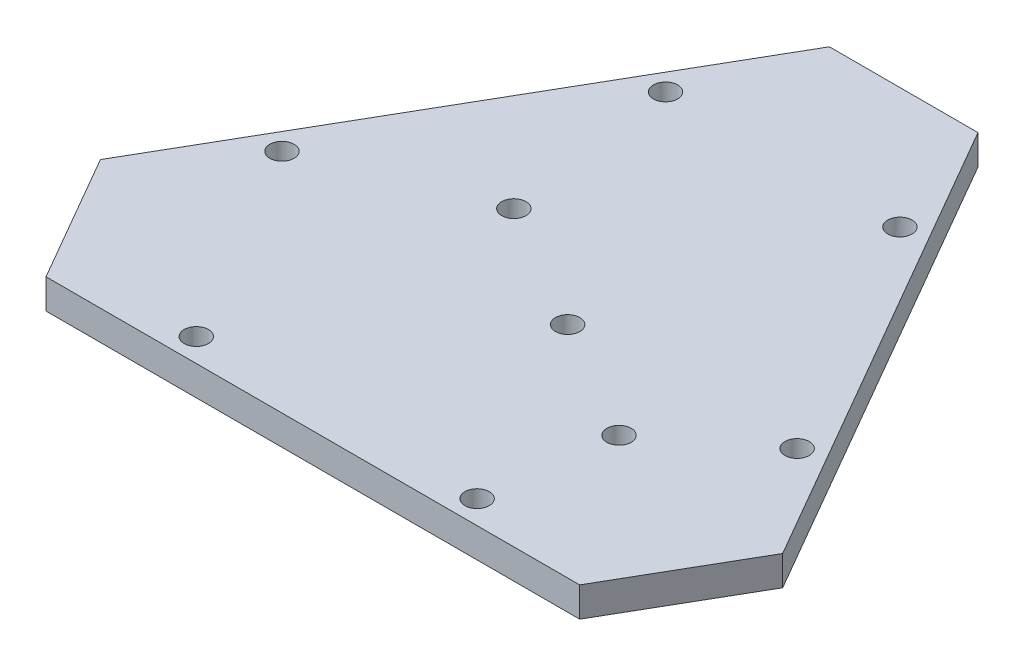
ISO-10303-21;
HEADER;
FILE_DESCRIPTION(('STEP AP214'),'2;1');
FILE_NAME('part.step','',(''),(''),'','','');
FILE_SCHEMA(('AUTOMOTIVE_DESIGN { 1 0 10303 214 1 1 1 1 }'));
ENDSEC;
DATA;
#1=APPLICATION_CONTEXT('core data for automotive mechanical design processes');
#2=APPLICATION_PROTOCOL_DEFINITION('international standard','automotive_design',2000,#1);
#3=PRODUCT_CONTEXT('',#1,'mechanical');
#4=PRODUCT('Part','Part','',(#3));
#5=PRODUCT_RELATED_PRODUCT_CATEGORY('part','',(#4));
#6=PRODUCT_DEFINITION_FORMATION('','',#4);
#7=PRODUCT_DEFINITION_CONTEXT('part definition',#1,'design');
#8=PRODUCT_DEFINITION('design','',#6,#7);
#9=PRODUCT_DEFINITION_SHAPE('','',#8);
#10=(LENGTH_UNIT() NAMED_UNIT(*) SI_UNIT(.MILLI.,.METRE.));
#11=(NAMED_UNIT(*) PLANE_ANGLE_UNIT() SI_UNIT($,.RADIAN.));
#12=(NAMED_UNIT(*) SI_UNIT($,.STERADIAN.) SOLID_ANGLE_UNIT());
#13=UNCERTAINTY_MEASURE_WITH_UNIT(LENGTH_MEASURE(1.E-05),#10,'distance_accuracy_value','');
#14=(GEOMETRIC_REPRESENTATION_CONTEXT(3) GLOBAL_UNCERTAINTY_ASSIGNED_CONTEXT((#13)) GLOBAL_UNIT_ASSIGNED_CONTEXT((#10,
#11,#12)) REPRESENTATION_CONTEXT('',''));
#15=CARTESIAN_POINT('',(0.,0.,0.));
#16=DIRECTION('',(0.,0.,1.));
#17=DIRECTION('',(1.,0.,0.));
#18=AXIS2_PLACEMENT_3D('',#15,#16,#17);
#19=CARTESIAN_POINT('',(-57.014405283833,6.35,51.2481532850778));
#20=DIRECTION('',(0.,0.,-1.));
#21=DIRECTION('',(-1.,0.,0.));
#22=AXIS2_PLACEMENT_3D('',#19,#20,#21);
#23=PLANE('',#22);
#24=DIRECTION('',(1.,0.,0.));
#25=VECTOR('',#24,1.);
#26=CARTESIAN_POINT('',(-57.014405283833,0.,51.2481532850778));
#27=LINE('',#26,#25);
#28=CARTESIAN_POINT('',(-57.014405283833,0.,51.2481532850778));
#29=VERTEX_POINT('',#28);
#30=CARTESIAN_POINT('',(57.0144052838327,0.,51.2481532850782));
#31=VERTEX_POINT('',#30);
#32=EDGE_CURVE('E133',#29,#31,#27,.T.);
#33=ORIENTED_EDGE('',*,*,#32,.T.);
#34=DIRECTION('',(0.,-1.,0.));
#35=VECTOR('',#34,1.);
#36=CARTESIAN_POINT('',(57.0144052838327,6.35,51.2481532850782));
#37=LINE('',#36,#35);
#38=CARTESIAN_POINT('',(57.0144052838327,6.35,51.2481532850782));
#39=VERTEX_POINT('',#38);
#40=EDGE_CURVE('E11',#39,#31,#37,.T.);
#41=ORIENTED_EDGE('',*,*,#40,.F.);
#42=DIRECTION('',(1.,0.,0.));
#43=VECTOR('',#42,1.);
#44=CARTESIAN_POINT('',(-57.014405283833,6.35,51.2481532850778));
#45=LINE('',#44,#43);
#46=CARTESIAN_POINT('',(-57.014405283833,6.35,51.2481532850778));
#47=VERTEX_POINT('',#46);
#48=EDGE_CURVE('E150',#47,#39,#45,.T.);
#49=ORIENTED_EDGE('',*,*,#48,.F.);
#50=DIRECTION('',(0.,-1.,0.));
#51=VECTOR('',#50,1.);
#52=CARTESIAN_POINT('',(-57.014405283833,6.35,51.2481532850778));
#53=LINE('',#52,#51);
#54=EDGE_CURVE('E129',#47,#29,#53,.T.);
#55=ORIENTED_EDGE('',*,*,#54,.T.);
#56=EDGE_LOOP('',(#33,#41,#49,#55));
#57=FACE_BOUND('',#56,.T.);
#58=ADVANCED_FACE('F44',(#57),#23,.F.);
#59=CARTESIAN_POINT('',(57.0144052838327,6.35,51.2481532850782));
#60=DIRECTION('',(-0.866025403784436,0.,-0.500000000000004));
#61=DIRECTION('',(-0.500000000000004,0.,0.866025403784436));
#62=AXIS2_PLACEMENT_3D('',#59,#60,#61);
#63=PLANE('',#62);
#64=DIRECTION('',(0.500000000000004,0.,-0.866025403784436));
#65=VECTOR('',#64,1.);
#66=CARTESIAN_POINT('',(57.0144052838327,0.,51.2481532850782));
#67=LINE('',#66,#65);
#68=CARTESIAN_POINT('',(72.8894052838328,0.,23.7518467149224));
#69=VERTEX_POINT('',#68);
#70=EDGE_CURVE('E137',#31,#69,#67,.T.);
#71=ORIENTED_EDGE('',*,*,#70,.T.);
#72=DIRECTION('',(0.,-1.,0.));
#73=VECTOR('',#72,1.);
#74=CARTESIAN_POINT('',(72.8894052838328,6.35,23.7518467149224));
#75=LINE('',#74,#73);
#76=CARTESIAN_POINT('',(72.8894052838328,6.35,23.7518467149224));
#77=VERTEX_POINT('',#76);
#78=EDGE_CURVE('E53',#77,#69,#75,.T.);
#79=ORIENTED_EDGE('',*,*,#78,.F.);
#80=DIRECTION('',(0.500000000000004,0.,-0.866025403784436));
#81=VECTOR('',#80,1.);
#82=CARTESIAN_POINT('',(57.0144052838327,6.35,51.2481532850782));
#83=LINE('',#82,#81);
#84=EDGE_CURVE('E98',#39,#77,#83,.T.);
#85=ORIENTED_EDGE('',*,*,#84,.F.);
#86=ORIENTED_EDGE('',*,*,#40,.T.);
#87=EDGE_LOOP('',(#71,#79,#85,#86));
#88=FACE_BOUND('',#87,.T.);
#89=ADVANCED_FACE('F179',(#88),#63,.F.);
#90=CARTESIAN_POINT('',(72.8894052838328,6.35,23.7518467149224));
#91=DIRECTION('',(-0.86602540378444,0.,0.499999999999998));
#92=DIRECTION('',(0.499999999999998,0.,0.86602540378444));
#93=AXIS2_PLACEMENT_3D('',#90,#91,#92);
#94=PLANE('',#93);
#95=DIRECTION('',(-0.499999999999998,0.,-0.86602540378444));
#96=VECTOR('',#95,1.);
#97=CARTESIAN_POINT('',(72.8894052838328,0.,23.7518467149224));
#98=LINE('',#97,#96);
#99=CARTESIAN_POINT('',(15.875,0.,-75.));
#100=VERTEX_POINT('',#99);
#101=EDGE_CURVE('E141',#69,#100,#98,.T.);
#102=ORIENTED_EDGE('',*,*,#101,.T.);
#103=DIRECTION('',(0.,-1.,0.));
#104=VECTOR('',#103,1.);
#105=CARTESIAN_POINT('',(15.875,6.35,-75.));
#106=LINE('',#105,#104);
#107=CARTESIAN_POINT('',(15.875,6.35,-75.));
#108=VERTEX_POINT('',#107);
#109=EDGE_CURVE('E122',#108,#100,#106,.T.);
#110=ORIENTED_EDGE('',*,*,#109,.F.);
#111=DIRECTION('',(-0.499999999999998,0.,-0.86602540378444));
#112=VECTOR('',#111,1.);
#113=CARTESIAN_POINT('',(72.8894052838328,6.35,23.7518467149224));
#114=LINE('',#113,#112);
#115=EDGE_CURVE('E111',#77,#108,#114,.T.);
#116=ORIENTED_EDGE('',*,*,#115,.F.);
#117=ORIENTED_EDGE('',*,*,#78,.T.);
#118=EDGE_LOOP('',(#102,#110,#116,#117));
#119=FACE_BOUND('',#118,.T.);
#120=ADVANCED_FACE('F160',(#119),#94,.F.);
#121=CARTESIAN_POINT('',(-15.875,6.35,-75.));
#122=DIRECTION('',(0.,0.,1.));
#123=DIRECTION('',(1.,0.,0.));
#124=AXIS2_PLACEMENT_3D('',#121,#122,#123);
#125=PLANE('',#124);
#126=DIRECTION('',(-1.,0.,0.));
#127=VECTOR('',#126,1.);
#128=CARTESIAN_POINT('',(-15.875,0.,-75.));
#129=LINE('',#128,#127);
#130=CARTESIAN_POINT('',(-15.875,0.,-75.));
#131=VERTEX_POINT('',#130);
#132=EDGE_CURVE('E120',#100,#131,#129,.T.);
#133=ORIENTED_EDGE('',*,*,#132,.T.);
#134=DIRECTION('',(0.,-1.,0.));
#135=VECTOR('',#134,1.);
#136=CARTESIAN_POINT('',(-15.875,6.35,-75.));
#137=LINE('',#136,#135);
#138=CARTESIAN_POINT('',(-15.875,6.35,-75.));
#139=VERTEX_POINT('',#138);
#140=EDGE_CURVE('E117',#139,#131,#137,.T.);
#141=ORIENTED_EDGE('',*,*,#140,.F.);
#142=DIRECTION('',(-1.,0.,0.));
#143=VECTOR('',#142,1.);
#144=CARTESIAN_POINT('',(-15.875,6.35,-75.));
#145=LINE('',#144,#143);
#146=EDGE_CURVE('E105',#108,#139,#145,.T.);
#147=ORIENTED_EDGE('',*,*,#146,.F.);
#148=ORIENTED_EDGE('',*,*,#109,.T.);
#149=EDGE_LOOP('',(#133,#141,#147,#148));
#150=FACE_BOUND('',#149,.T.);
#151=ADVANCED_FACE('F118',(#150),#125,.F.);
#152=CARTESIAN_POINT('',(-15.875,6.35,-75.));
#153=DIRECTION('',(0.866025403784438,0.,0.500000000000001));
#154=DIRECTION('',(0.500000000000001,0.,-0.866025403784438));
#155=AXIS2_PLACEMENT_3D('',#152,#153,#154);
#156=PLANE('',#155);
#157=DIRECTION('',(-0.500000000000001,0.,0.866025403784438));
#158=VECTOR('',#157,1.);
#159=CARTESIAN_POINT('',(-15.875,0.,-75.));
#160=LINE('',#159,#158);
#161=CARTESIAN_POINT('',(-72.8894052838329,0.,23.7518467149219));
#162=VERTEX_POINT('',#161);
#163=EDGE_CURVE('E84',#131,#162,#160,.T.);
#164=ORIENTED_EDGE('',*,*,#163,.T.);
#165=DIRECTION('',(0.,-1.,0.));
#166=VECTOR('',#165,1.);
#167=CARTESIAN_POINT('',(-72.8894052838329,6.35,23.7518467149219));
#168=LINE('',#167,#166);
#169=CARTESIAN_POINT('',(-72.8894052838329,6.35,23.7518467149219));
#170=VERTEX_POINT('',#169);
#171=EDGE_CURVE('E123',#170,#162,#168,.T.);
#172=ORIENTED_EDGE('',*,*,#171,.F.);
#173=DIRECTION('',(-0.500000000000001,0.,0.866025403784438));
#174=VECTOR('',#173,1.);
#175=CARTESIAN_POINT('',(-15.875,6.35,-75.));
#176=LINE('',#175,#174);
#177=EDGE_CURVE('E109',#139,#170,#176,.T.);
#178=ORIENTED_EDGE('',*,*,#177,.F.);
#179=ORIENTED_EDGE('',*,*,#140,.T.);
#180=EDGE_LOOP('',(#164,#172,#178,#179));
#181=FACE_BOUND('',#180,.T.);
#182=ADVANCED_FACE('F125',(#181),#156,.F.);
#183=CARTESIAN_POINT('',(-57.014405283833,6.35,51.2481532850778));
#184=DIRECTION('',(0.86602540378444,0.,-0.499999999999998));
#185=DIRECTION('',(-0.499999999999998,0.,-0.86602540378444));
#186=AXIS2_PLACEMENT_3D('',#183,#184,#185);
#187=PLANE('',#186);
#188=DIRECTION('',(0.499999999999998,0.,0.86602540378444));
#189=VECTOR('',#188,1.);
#190=CARTESIAN_POINT('',(-57.014405283833,0.,51.2481532850778));
#191=LINE('',#190,#189);
#192=EDGE_CURVE('E90',#162,#29,#191,.T.);
#193=ORIENTED_EDGE('',*,*,#192,.T.);
#194=ORIENTED_EDGE('',*,*,#54,.F.);
#195=DIRECTION('',(0.499999999999998,0.,0.86602540378444));
#196=VECTOR('',#195,1.);
#197=CARTESIAN_POINT('',(-57.014405283833,6.35,51.2481532850778));
#198=LINE('',#197,#196);
#199=EDGE_CURVE('E61',#170,#47,#198,.T.);
#200=ORIENTED_EDGE('',*,*,#199,.F.);
#201=ORIENTED_EDGE('',*,*,#171,.T.);
#202=EDGE_LOOP('',(#193,#194,#200,#201));
#203=FACE_BOUND('',#202,.T.);
#204=ADVANCED_FACE('F167',(#203),#187,.F.);
#205=CARTESIAN_POINT('',(0.,6.35,0.));
#206=DIRECTION('',(0.,1.,0.));
#207=DIRECTION('',(0.,0.,1.));
#208=AXIS2_PLACEMENT_3D('',#205,#206,#207);
#209=PLANE('',#208);
#210=CARTESIAN_POINT('',(33.5392518830543,6.35,19.3638961031003));
#211=DIRECTION('',(0.,1.,0.));
#212=DIRECTION('',(0.,0.,1.));
#213=AXIS2_PLACEMENT_3D('',#210,#211,#212);
#214=CIRCLE('',#213,2.6);
#215=CARTESIAN_POINT('',(33.5392518830543,6.35,21.9638961031003));
#216=VERTEX_POINT('',#215);
#217=EDGE_CURVE('E363',#216,#216,#214,.T.);
#218=ORIENTED_EDGE('',*,*,#217,.F.);
#219=EDGE_LOOP('',(#218));
#220=FACE_BOUND('',#219,.T.);
#221=CARTESIAN_POINT('',(7.55848976952117,6.35,4.36389610310027));
#222=DIRECTION('',(0.,1.,0.));
#223=DIRECTION('',(0.,0.,1.));
#224=AXIS2_PLACEMENT_3D('',#221,#222,#223);
#225=CIRCLE('',#224,2.6);
#226=CARTESIAN_POINT('',(7.55848976952117,6.35,6.96389610310027));
#227=VERTEX_POINT('',#226);
#228=EDGE_CURVE('E365',#227,#227,#225,.T.);
#229=ORIENTED_EDGE('',*,*,#228,.F.);
#230=EDGE_LOOP('',(#229));
#231=FACE_BOUND('',#230,.T.);
#232=CARTESIAN_POINT('',(-19.638606793364,6.35,-11.3383549186578));
#233=DIRECTION('',(0.,1.,0.));
#234=DIRECTION('',(0.,0.,1.));
#235=AXIS2_PLACEMENT_3D('',#232,#233,#234);
#236=CIRCLE('',#235,2.6);
#237=CARTESIAN_POINT('',(-19.638606793364,6.35,-8.73835491865783));
#238=VERTEX_POINT('',#237);
#239=EDGE_CURVE('E378',#238,#238,#236,.T.);
#240=ORIENTED_EDGE('',*,*,#239,.F.);
#241=EDGE_LOOP('',(#240));
#242=FACE_BOUND('',#241,.T.);
#243=CARTESIAN_POINT('',(-55.0301887449073,6.35,2.81877628612842));
#244=DIRECTION('',(0.,1.,0.));
#245=DIRECTION('',(0.,0.,1.));
#246=AXIS2_PLACEMENT_3D('',#243,#244,#245);
#247=CIRCLE('',#246,2.6);
#248=CARTESIAN_POINT('',(-55.0301887449073,6.35,5.41877628612841));
#249=VERTEX_POINT('',#248);
#250=EDGE_CURVE('E403',#249,#249,#247,.T.);
#251=ORIENTED_EDGE('',*,*,#250,.F.);
#252=EDGE_LOOP('',(#251));
#253=FACE_BOUND('',#252,.T.);
#254=CARTESIAN_POINT('',(30.0988433702189,6.35,46.2481532850775));
#255=DIRECTION('',(0.,1.,0.));
#256=DIRECTION('',(0.,0.,1.));
#257=AXIS2_PLACEMENT_3D('',#254,#255,#256);
#258=CIRCLE('',#257,2.6);
#259=CARTESIAN_POINT('',(30.0988433702189,6.35,48.8481532850775));
#260=VERTEX_POINT('',#259);
#261=EDGE_CURVE('E394',#260,#260,#258,.T.);
#262=ORIENTED_EDGE('',*,*,#261,.F.);
#263=EDGE_LOOP('',(#262));
#264=FACE_BOUND('',#263,.T.);
#265=CARTESIAN_POINT('',(55.008731986365,6.35,2.78123818993755));
#266=DIRECTION('',(0.,1.,0.));
#267=DIRECTION('',(0.,0.,1.));
#268=AXIS2_PLACEMENT_3D('',#265,#266,#267);
#269=CIRCLE('',#268,2.6);
#270=CARTESIAN_POINT('',(55.008731986365,6.35,5.38123818993754));
#271=VERTEX_POINT('',#270);
#272=EDGE_CURVE('E419',#271,#271,#269,.T.);
#273=ORIENTED_EDGE('',*,*,#272,.F.);
#274=EDGE_LOOP('',(#273));
#275=FACE_BOUND('',#274,.T.);
#276=CARTESIAN_POINT('',(25.0085700829616,6.35,-49.1801925618189));
#277=DIRECTION('',(0.,1.,0.));
#278=DIRECTION('',(0.,0.,1.));
#279=AXIS2_PLACEMENT_3D('',#276,#277,#278);
#280=CIRCLE('',#279,2.6);
#281=CARTESIAN_POINT('',(25.0085700829616,6.35,-46.5801925618189));
#282=VERTEX_POINT('',#281);
#283=EDGE_CURVE('E410',#282,#282,#280,.T.);
#284=ORIENTED_EDGE('',*,*,#283,.F.);
#285=EDGE_LOOP('',(#284));
#286=FACE_BOUND('',#285,.T.);
#287=CARTESIAN_POINT('',(-29.9011566297811,6.35,46.2481532850778));
#288=DIRECTION('',(0.,1.,0.));
#289=DIRECTION('',(0.,0.,1.));
#290=AXIS2_PLACEMENT_3D('',#287,#288,#289);
#291=CIRCLE('',#290,2.6);
#292=CARTESIAN_POINT('',(-29.9011566297811,6.35,48.8481532850778));
#293=VERTEX_POINT('',#292);
#294=EDGE_CURVE('E386',#293,#293,#291,.T.);
#295=ORIENTED_EDGE('',*,*,#294,.F.);
#296=EDGE_LOOP('',(#295));
#297=FACE_BOUND('',#296,.T.);
#298=CARTESIAN_POINT('',(-25.0303122781621,6.35,-49.1428192627));
#299=DIRECTION('',(0.,1.,0.));
#300=DIRECTION('',(0.,0.,1.));
#301=AXIS2_PLACEMENT_3D('',#298,#299,#300);
#302=CIRCLE('',#301,2.6);
#303=CARTESIAN_POINT('',(-25.0303122781621,6.35,-46.5428192627));
#304=VERTEX_POINT('',#303);
#305=EDGE_CURVE('E414',#304,#304,#302,.T.);
#306=ORIENTED_EDGE('',*,*,#305,.F.);
#307=EDGE_LOOP('',(#306));
#308=FACE_BOUND('',#307,.T.);
#309=ORIENTED_EDGE('',*,*,#48,.T.);
#310=ORIENTED_EDGE('',*,*,#84,.T.);
#311=ORIENTED_EDGE('',*,*,#115,.T.);
#312=ORIENTED_EDGE('',*,*,#146,.T.);
#313=ORIENTED_EDGE('',*,*,#177,.T.);
#314=ORIENTED_EDGE('',*,*,#199,.T.);
#315=EDGE_LOOP('',(#309,#310,#311,#312,#313,#314));
#316=FACE_BOUND('',#315,.T.);
#317=ADVANCED_FACE('F107',(#220,#231,#242,#253,#264,#275,#286,#297,#308,#316),#209,.T.);
#318=CARTESIAN_POINT('',(0.,0.,0.));
#319=DIRECTION('',(0.,1.,0.));
#320=DIRECTION('',(0.,0.,1.));
#321=AXIS2_PLACEMENT_3D('',#318,#319,#320);
#322=PLANE('',#321);
#323=CARTESIAN_POINT('',(33.5392518830543,0.,19.3638961031003));
#324=DIRECTION('',(0.,1.,0.));
#325=DIRECTION('',(0.,0.,1.));
#326=AXIS2_PLACEMENT_3D('',#323,#324,#325);
#327=CIRCLE('',#326,2.6);
#328=CARTESIAN_POINT('',(33.5392518830543,0.,21.9638961031003));
#329=VERTEX_POINT('',#328);
#330=EDGE_CURVE('E360',#329,#329,#327,.T.);
#331=ORIENTED_EDGE('',*,*,#330,.T.);
#332=EDGE_LOOP('',(#331));
#333=FACE_BOUND('',#332,.T.);
#334=CARTESIAN_POINT('',(7.55848976952117,0.,4.36389610310027));
#335=DIRECTION('',(0.,1.,0.));
#336=DIRECTION('',(0.,0.,1.));
#337=AXIS2_PLACEMENT_3D('',#334,#335,#336);
#338=CIRCLE('',#337,2.6);
#339=CARTESIAN_POINT('',(7.55848976952117,0.,6.96389610310027));
#340=VERTEX_POINT('',#339);
#341=EDGE_CURVE('E372',#340,#340,#338,.T.);
#342=ORIENTED_EDGE('',*,*,#341,.T.);
#343=EDGE_LOOP('',(#342));
#344=FACE_BOUND('',#343,.T.);
#345=CARTESIAN_POINT('',(-19.638606793364,0.,-11.3383549186578));
#346=DIRECTION('',(0.,1.,0.));
#347=DIRECTION('',(0.,0.,1.));
#348=AXIS2_PLACEMENT_3D('',#345,#346,#347);
#349=CIRCLE('',#348,2.6);
#350=CARTESIAN_POINT('',(-19.638606793364,0.,-8.73835491865783));
#351=VERTEX_POINT('',#350);
#352=EDGE_CURVE('E382',#351,#351,#349,.T.);
#353=ORIENTED_EDGE('',*,*,#352,.T.);
#354=EDGE_LOOP('',(#353));
#355=FACE_BOUND('',#354,.T.);
#356=CARTESIAN_POINT('',(-55.0301887449073,0.,2.81877628612842));
#357=DIRECTION('',(0.,1.,0.));
#358=DIRECTION('',(0.,0.,1.));
#359=AXIS2_PLACEMENT_3D('',#356,#357,#358);
#360=CIRCLE('',#359,2.6);
#361=CARTESIAN_POINT('',(-55.0301887449073,0.,5.41877628612841));
#362=VERTEX_POINT('',#361);
#363=EDGE_CURVE('E390',#362,#362,#360,.T.);
#364=ORIENTED_EDGE('',*,*,#363,.T.);
#365=EDGE_LOOP('',(#364));
#366=FACE_BOUND('',#365,.T.);
#367=CARTESIAN_POINT('',(30.0988433702189,0.,46.2481532850775));
#368=DIRECTION('',(0.,1.,0.));
#369=DIRECTION('',(0.,0.,1.));
#370=AXIS2_PLACEMENT_3D('',#367,#368,#369);
#371=CIRCLE('',#370,2.6);
#372=CARTESIAN_POINT('',(30.0988433702189,0.,48.8481532850775));
#373=VERTEX_POINT('',#372);
#374=EDGE_CURVE('E399',#373,#373,#371,.T.);
#375=ORIENTED_EDGE('',*,*,#374,.T.);
#376=EDGE_LOOP('',(#375));
#377=FACE_BOUND('',#376,.T.);
#378=CARTESIAN_POINT('',(55.008731986365,0.,2.78123818993755));
#379=DIRECTION('',(0.,1.,0.));
#380=DIRECTION('',(0.,0.,1.));
#381=AXIS2_PLACEMENT_3D('',#378,#379,#380);
#382=CIRCLE('',#381,2.6);
#383=CARTESIAN_POINT('',(55.008731986365,0.,5.38123818993754));
#384=VERTEX_POINT('',#383);
#385=EDGE_CURVE('E398',#384,#384,#382,.T.);
#386=ORIENTED_EDGE('',*,*,#385,.T.);
#387=EDGE_LOOP('',(#386));
#388=FACE_BOUND('',#387,.T.);
#389=CARTESIAN_POINT('',(25.0085700829616,0.,-49.1801925618189));
#390=DIRECTION('',(0.,1.,0.));
#391=DIRECTION('',(0.,0.,1.));
#392=AXIS2_PLACEMENT_3D('',#389,#390,#391);
#393=CIRCLE('',#392,2.6);
#394=CARTESIAN_POINT('',(25.0085700829616,0.,-46.5801925618189));
#395=VERTEX_POINT('',#394);
#396=EDGE_CURVE('E415',#395,#395,#393,.T.);
#397=ORIENTED_EDGE('',*,*,#396,.T.);
#398=EDGE_LOOP('',(#397));
#399=FACE_BOUND('',#398,.T.);
#400=CARTESIAN_POINT('',(-29.9011566297811,0.,46.2481532850778));
#401=DIRECTION('',(0.,1.,0.));
#402=DIRECTION('',(0.,0.,1.));
#403=AXIS2_PLACEMENT_3D('',#400,#401,#402);
#404=CIRCLE('',#403,2.6);
#405=CARTESIAN_POINT('',(-29.9011566297811,0.,48.8481532850778));
#406=VERTEX_POINT('',#405);
#407=EDGE_CURVE('E369',#406,#406,#404,.T.);
#408=ORIENTED_EDGE('',*,*,#407,.T.);
#409=EDGE_LOOP('',(#408));
#410=FACE_BOUND('',#409,.T.);
#411=CARTESIAN_POINT('',(-25.0303122781621,0.,-49.1428192627));
#412=DIRECTION('',(0.,1.,0.));
#413=DIRECTION('',(0.,0.,1.));
#414=AXIS2_PLACEMENT_3D('',#411,#412,#413);
#415=CIRCLE('',#414,2.6);
#416=CARTESIAN_POINT('',(-25.0303122781621,0.,-46.5428192627));
#417=VERTEX_POINT('',#416);
#418=EDGE_CURVE('E138',#417,#417,#415,.T.);
#419=ORIENTED_EDGE('',*,*,#418,.T.);
#420=EDGE_LOOP('',(#419));
#421=FACE_BOUND('',#420,.T.);
#422=ORIENTED_EDGE('',*,*,#32,.F.);
#423=ORIENTED_EDGE('',*,*,#192,.F.);
#424=ORIENTED_EDGE('',*,*,#163,.F.);
#425=ORIENTED_EDGE('',*,*,#132,.F.);
#426=ORIENTED_EDGE('',*,*,#101,.F.);
#427=ORIENTED_EDGE('',*,*,#70,.F.);
#428=EDGE_LOOP('',(#422,#423,#424,#425,#426,#427));
#429=FACE_BOUND('',#428,.T.);
#430=ADVANCED_FACE('F163',(#333,#344,#355,#366,#377,#388,#399,#410,#421,#429),#322,.F.);
#431=CARTESIAN_POINT('',(-25.0303122781621,0.,-49.1428192627));
#432=DIRECTION('',(0.,1.,0.));
#433=DIRECTION('',(0.,0.,1.));
#434=AXIS2_PLACEMENT_3D('',#431,#432,#433);
#435=CYLINDRICAL_SURFACE('',#434,2.6);
#436=ORIENTED_EDGE('',*,*,#418,.F.);
#437=EDGE_LOOP('',(#436));
#438=FACE_BOUND('',#437,.T.);
#439=ORIENTED_EDGE('',*,*,#305,.T.);
#440=EDGE_LOOP('',(#439));
#441=FACE_BOUND('',#440,.T.);
#442=ADVANCED_FACE('F209',(#438,#441),#435,.F.);
#443=CARTESIAN_POINT('',(-29.9011566297811,0.,46.2481532850778));
#444=DIRECTION('',(0.,1.,0.));
#445=DIRECTION('',(0.,0.,1.));
#446=AXIS2_PLACEMENT_3D('',#443,#444,#445);
#447=CYLINDRICAL_SURFACE('',#446,2.6);
#448=ORIENTED_EDGE('',*,*,#407,.F.);
#449=EDGE_LOOP('',(#448));
#450=FACE_BOUND('',#449,.T.);
#451=ORIENTED_EDGE('',*,*,#294,.T.);
#452=EDGE_LOOP('',(#451));
#453=FACE_BOUND('',#452,.T.);
#454=ADVANCED_FACE('F214',(#450,#453),#447,.F.);
#455=CARTESIAN_POINT('',(25.0085700829616,0.,-49.1801925618189));
#456=DIRECTION('',(0.,1.,0.));
#457=DIRECTION('',(0.,0.,1.));
#458=AXIS2_PLACEMENT_3D('',#455,#456,#457);
#459=CYLINDRICAL_SURFACE('',#458,2.6);
#460=ORIENTED_EDGE('',*,*,#396,.F.);
#461=EDGE_LOOP('',(#460));
#462=FACE_BOUND('',#461,.T.);
#463=ORIENTED_EDGE('',*,*,#283,.T.);
#464=EDGE_LOOP('',(#463));
#465=FACE_BOUND('',#464,.T.);
#466=ADVANCED_FACE('F227',(#462,#465),#459,.F.);
#467=CARTESIAN_POINT('',(55.008731986365,0.,2.78123818993755));
#468=DIRECTION('',(0.,1.,0.));
#469=DIRECTION('',(0.,0.,1.));
#470=AXIS2_PLACEMENT_3D('',#467,#468,#469);
#471=CYLINDRICAL_SURFACE('',#470,2.6);
#472=ORIENTED_EDGE('',*,*,#385,.F.);
#473=EDGE_LOOP('',(#472));
#474=FACE_BOUND('',#473,.T.);
#475=ORIENTED_EDGE('',*,*,#272,.T.);
#476=EDGE_LOOP('',(#475));
#477=FACE_BOUND('',#476,.T.);
#478=ADVANCED_FACE('F238',(#474,#477),#471,.F.);
#479=CARTESIAN_POINT('',(30.0988433702189,0.,46.2481532850775));
#480=DIRECTION('',(0.,1.,0.));
#481=DIRECTION('',(0.,0.,1.));
#482=AXIS2_PLACEMENT_3D('',#479,#480,#481);
#483=CYLINDRICAL_SURFACE('',#482,2.6);
#484=ORIENTED_EDGE('',*,*,#374,.F.);
#485=EDGE_LOOP('',(#484));
#486=FACE_BOUND('',#485,.T.);
#487=ORIENTED_EDGE('',*,*,#261,.T.);
#488=EDGE_LOOP('',(#487));
#489=FACE_BOUND('',#488,.T.);
#490=ADVANCED_FACE('F249',(#486,#489),#483,.F.);
#491=CARTESIAN_POINT('',(-55.0301887449073,0.,2.81877628612842));
#492=DIRECTION('',(0.,1.,0.));
#493=DIRECTION('',(0.,0.,1.));
#494=AXIS2_PLACEMENT_3D('',#491,#492,#493);
#495=CYLINDRICAL_SURFACE('',#494,2.6);
#496=ORIENTED_EDGE('',*,*,#363,.F.);
#497=EDGE_LOOP('',(#496));
#498=FACE_BOUND('',#497,.T.);
#499=ORIENTED_EDGE('',*,*,#250,.T.);
#500=EDGE_LOOP('',(#499));
#501=FACE_BOUND('',#500,.T.);
#502=ADVANCED_FACE('F260',(#498,#501),#495,.F.);
#503=CARTESIAN_POINT('',(-19.638606793364,0.,-11.3383549186578));
#504=DIRECTION('',(0.,1.,0.));
#505=DIRECTION('',(0.,0.,1.));
#506=AXIS2_PLACEMENT_3D('',#503,#504,#505);
#507=CYLINDRICAL_SURFACE('',#506,2.6);
#508=ORIENTED_EDGE('',*,*,#352,.F.);
#509=EDGE_LOOP('',(#508));
#510=FACE_BOUND('',#509,.T.);
#511=ORIENTED_EDGE('',*,*,#239,.T.);
#512=EDGE_LOOP('',(#511));
#513=FACE_BOUND('',#512,.T.);
#514=ADVANCED_FACE('F271',(#510,#513),#507,.F.);
#515=CARTESIAN_POINT('',(7.55848976952117,0.,4.36389610310027));
#516=DIRECTION('',(0.,1.,0.));
#517=DIRECTION('',(0.,0.,1.));
#518=AXIS2_PLACEMENT_3D('',#515,#516,#517);
#519=CYLINDRICAL_SURFACE('',#518,2.6);
#520=ORIENTED_EDGE('',*,*,#341,.F.);
#521=EDGE_LOOP('',(#520));
#522=FACE_BOUND('',#521,.T.);
#523=ORIENTED_EDGE('',*,*,#228,.T.);
#524=EDGE_LOOP('',(#523));
#525=FACE_BOUND('',#524,.T.);
#526=ADVANCED_FACE('F295',(#522,#525),#519,.F.);
#527=CARTESIAN_POINT('',(33.5392518830543,0.,19.3638961031003));
#528=DIRECTION('',(0.,1.,0.));
#529=DIRECTION('',(0.,0.,1.));
#530=AXIS2_PLACEMENT_3D('',#527,#528,#529);
#531=CYLINDRICAL_SURFACE('',#530,2.6);
#532=ORIENTED_EDGE('',*,*,#330,.F.);
#533=EDGE_LOOP('',(#532));
#534=FACE_BOUND('',#533,.T.);
#535=ORIENTED_EDGE('',*,*,#217,.T.);
#536=EDGE_LOOP('',(#535));
#537=FACE_BOUND('',#536,.T.);
#538=ADVANCED_FACE('F306',(#534,#537),#531,.F.);
#539=CLOSED_SHELL('',(#58,#89,#120,#151,#182,#204,#317,#430,#442,#454,#466,#478,#490,#502,#514,
#526,#538));
#540=MANIFOLD_SOLID_BREP('B2',#539);
#541=ADVANCED_BREP_SHAPE_REPRESENTATION('',(#18,#540),#14);
#542=SHAPE_DEFINITION_REPRESENTATION(#9,#541);
ENDSEC;
END-ISO-10303-21;
